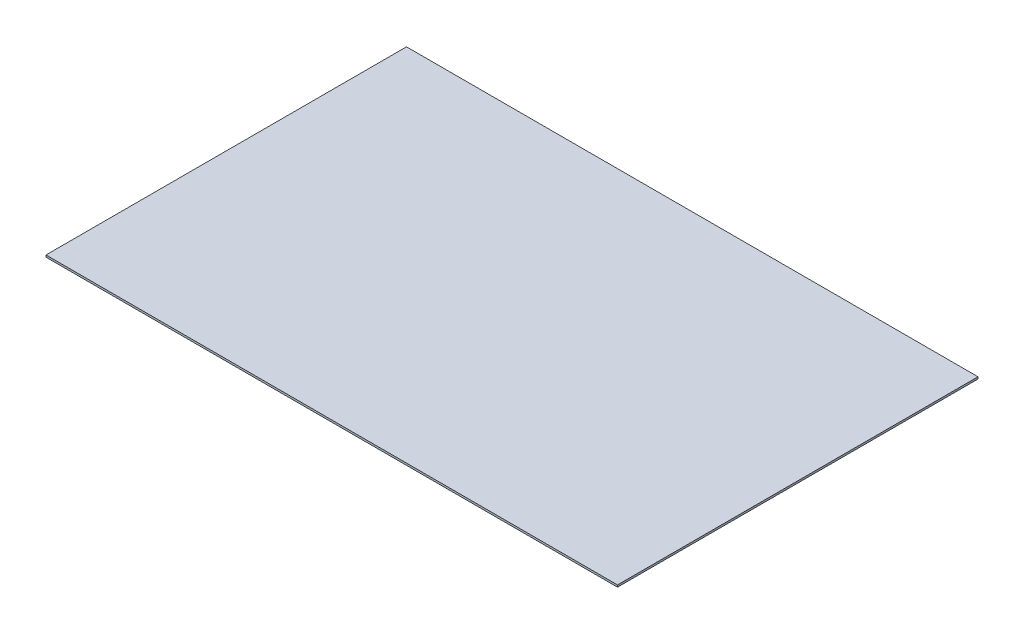
ISO-10303-21;
HEADER;
FILE_DESCRIPTION(('STEP AP214'),'2;1');
FILE_NAME('part.step','',(''),(''),'','','');
FILE_SCHEMA(('AUTOMOTIVE_DESIGN { 1 0 10303 214 1 1 1 1 }'));
ENDSEC;
DATA;
#1=APPLICATION_CONTEXT('core data for automotive mechanical design processes');
#2=APPLICATION_PROTOCOL_DEFINITION('international standard','automotive_design',2000,#1);
#3=PRODUCT_CONTEXT('',#1,'mechanical');
#4=PRODUCT('Part','Part','',(#3));
#5=PRODUCT_RELATED_PRODUCT_CATEGORY('part','',(#4));
#6=PRODUCT_DEFINITION_FORMATION('','',#4);
#7=PRODUCT_DEFINITION_CONTEXT('part definition',#1,'design');
#8=PRODUCT_DEFINITION('design','',#6,#7);
#9=PRODUCT_DEFINITION_SHAPE('','',#8);
#10=(LENGTH_UNIT() NAMED_UNIT(*) SI_UNIT(.MILLI.,.METRE.));
#11=(NAMED_UNIT(*) PLANE_ANGLE_UNIT() SI_UNIT($,.RADIAN.));
#12=(NAMED_UNIT(*) SI_UNIT($,.STERADIAN.) SOLID_ANGLE_UNIT());
#13=UNCERTAINTY_MEASURE_WITH_UNIT(LENGTH_MEASURE(1.E-05),#10,'distance_accuracy_value','');
#14=(GEOMETRIC_REPRESENTATION_CONTEXT(3) GLOBAL_UNCERTAINTY_ASSIGNED_CONTEXT((#13)) GLOBAL_UNIT_ASSIGNED_CONTEXT((#10,
#11,#12)) REPRESENTATION_CONTEXT('',''));
#15=CARTESIAN_POINT('',(0.,0.,0.));
#16=DIRECTION('',(0.,0.,1.));
#17=DIRECTION('',(1.,0.,0.));
#18=AXIS2_PLACEMENT_3D('',#15,#16,#17);
#19=CARTESIAN_POINT('',(319.883383766729,-2.99999999999945,243.174946603476));
#20=DIRECTION('',(0.,0.,-1.));
#21=DIRECTION('',(0.,1.,0.));
#22=AXIS2_PLACEMENT_3D('',#19,#20,#21);
#23=PLANE('',#22);
#24=DIRECTION('',(1.,0.,0.));
#25=VECTOR('',#24,1.);
#26=CARTESIAN_POINT('',(319.883383766729,5.55111512312578E-13,243.174946603476));
#27=LINE('',#26,#25);
#28=CARTESIAN_POINT('',(432.883383766729,-2.22044604925031E-13,243.174946603476));
#29=VERTEX_POINT('',#28);
#30=CARTESIAN_POINT('',(-437.964067469527,0.,243.174946603476));
#31=VERTEX_POINT('',#30);
#32=EDGE_CURVE('E65',#29,#31,#27,.F.);
#33=ORIENTED_EDGE('',*,*,#32,.T.);
#34=DIRECTION('',(0.,1.,0.));
#35=VECTOR('',#34,1.);
#36=CARTESIAN_POINT('',(-437.964067469527,-3.,243.174946603476));
#37=LINE('',#36,#35);
#38=CARTESIAN_POINT('',(-437.964067469527,-3.,243.174946603476));
#39=VERTEX_POINT('',#38);
#40=EDGE_CURVE('E114',#39,#31,#37,.T.);
#41=ORIENTED_EDGE('',*,*,#40,.F.);
#42=DIRECTION('',(-1.,0.,0.));
#43=VECTOR('',#42,1.);
#44=CARTESIAN_POINT('',(319.883383766728,-2.99999999999945,243.174946603476));
#45=LINE('',#44,#43);
#46=CARTESIAN_POINT('',(432.883383766729,-3.00000000000022,243.174946603476));
#47=VERTEX_POINT('',#46);
#48=EDGE_CURVE('E108',#47,#39,#45,.T.);
#49=ORIENTED_EDGE('',*,*,#48,.F.);
#50=DIRECTION('',(0.,1.,0.));
#51=VECTOR('',#50,1.);
#52=CARTESIAN_POINT('',(432.883383766729,-3.00000000000022,243.174946603476));
#53=LINE('',#52,#51);
#54=EDGE_CURVE('E71',#47,#29,#53,.T.);
#55=ORIENTED_EDGE('',*,*,#54,.T.);
#56=EDGE_LOOP('',(#33,#41,#49,#55));
#57=FACE_BOUND('',#56,.T.);
#58=ADVANCED_FACE('F61',(#57),#23,.F.);
#59=CARTESIAN_POINT('',(432.883383766729,-3.00000000000022,-306.142300289278));
#60=DIRECTION('',(0.,0.,1.));
#61=DIRECTION('',(0.,-1.,0.));
#62=AXIS2_PLACEMENT_3D('',#59,#60,#61);
#63=PLANE('',#62);
#64=DIRECTION('',(1.,0.,0.));
#65=VECTOR('',#64,1.);
#66=CARTESIAN_POINT('',(319.883383766728,-2.99999999999945,-306.142300289278));
#67=LINE('',#66,#65);
#68=CARTESIAN_POINT('',(-437.964067469527,-3.,-306.142300289278));
#69=VERTEX_POINT('',#68);
#70=CARTESIAN_POINT('',(432.883383766729,-3.00000000000022,-306.142300289278));
#71=VERTEX_POINT('',#70);
#72=EDGE_CURVE('E102',#69,#71,#67,.T.);
#73=ORIENTED_EDGE('',*,*,#72,.F.);
#74=DIRECTION('',(0.,1.,0.));
#75=VECTOR('',#74,1.);
#76=CARTESIAN_POINT('',(-437.964067469527,-3.,-306.142300289278));
#77=LINE('',#76,#75);
#78=CARTESIAN_POINT('',(-437.964067469527,0.,-306.142300289278));
#79=VERTEX_POINT('',#78);
#80=EDGE_CURVE('E118',#69,#79,#77,.T.);
#81=ORIENTED_EDGE('',*,*,#80,.T.);
#82=DIRECTION('',(-1.,0.,0.));
#83=VECTOR('',#82,1.);
#84=CARTESIAN_POINT('',(432.883383766729,-2.22044604925031E-13,-306.142300289278));
#85=LINE('',#84,#83);
#86=CARTESIAN_POINT('',(432.883383766729,-2.22044604925031E-13,-306.142300289278));
#87=VERTEX_POINT('',#86);
#88=EDGE_CURVE('E98',#79,#87,#85,.F.);
#89=ORIENTED_EDGE('',*,*,#88,.T.);
#90=DIRECTION('',(0.,1.,0.));
#91=VECTOR('',#90,1.);
#92=CARTESIAN_POINT('',(432.883383766729,-3.00000000000022,-306.142300289278));
#93=LINE('',#92,#91);
#94=EDGE_CURVE('E13',#71,#87,#93,.T.);
#95=ORIENTED_EDGE('',*,*,#94,.F.);
#96=EDGE_LOOP('',(#73,#81,#89,#95));
#97=FACE_BOUND('',#96,.T.);
#98=ADVANCED_FACE('F134',(#97),#63,.F.);
#99=CARTESIAN_POINT('',(319.883383766728,-2.99999999999945,0.));
#100=DIRECTION('',(0.,1.,0.));
#101=DIRECTION('',(-1.,0.,0.));
#102=AXIS2_PLACEMENT_3D('',#99,#100,#101);
#103=PLANE('',#102);
#104=ORIENTED_EDGE('',*,*,#48,.T.);
#105=DIRECTION('',(0.,0.,1.));
#106=VECTOR('',#105,1.);
#107=CARTESIAN_POINT('',(-437.964067469527,-3.,-306.142300289278));
#108=LINE('',#107,#106);
#109=EDGE_CURVE('E123',#69,#39,#108,.T.);
#110=ORIENTED_EDGE('',*,*,#109,.F.);
#111=ORIENTED_EDGE('',*,*,#72,.T.);
#112=DIRECTION('',(0.,0.,1.));
#113=VECTOR('',#112,1.);
#114=CARTESIAN_POINT('',(432.883383766729,-3.00000000000022,0.));
#115=LINE('',#114,#113);
#116=EDGE_CURVE('E80',#71,#47,#115,.T.);
#117=ORIENTED_EDGE('',*,*,#116,.T.);
#118=EDGE_LOOP('',(#104,#110,#111,#117));
#119=FACE_BOUND('',#118,.T.);
#120=ADVANCED_FACE('F133',(#119),#103,.F.);
#121=CARTESIAN_POINT('',(0.,0.,0.));
#122=DIRECTION('',(0.,1.,0.));
#123=DIRECTION('',(0.,0.,1.));
#124=AXIS2_PLACEMENT_3D('',#121,#122,#123);
#125=PLANE('',#124);
#126=ORIENTED_EDGE('',*,*,#88,.F.);
#127=DIRECTION('',(0.,0.,1.));
#128=VECTOR('',#127,1.);
#129=CARTESIAN_POINT('',(-437.964067469527,0.,-306.142300289278));
#130=LINE('',#129,#128);
#131=EDGE_CURVE('E122',#79,#31,#130,.T.);
#132=ORIENTED_EDGE('',*,*,#131,.T.);
#133=ORIENTED_EDGE('',*,*,#32,.F.);
#134=DIRECTION('',(0.,0.,-1.));
#135=VECTOR('',#134,1.);
#136=CARTESIAN_POINT('',(432.883383766729,-2.22044604925031E-13,243.174946603476));
#137=LINE('',#136,#135);
#138=EDGE_CURVE('E90',#87,#29,#137,.F.);
#139=ORIENTED_EDGE('',*,*,#138,.F.);
#140=EDGE_LOOP('',(#126,#132,#133,#139));
#141=FACE_BOUND('',#140,.T.);
#142=ADVANCED_FACE('F63',(#141),#125,.T.);
#143=CARTESIAN_POINT('',(432.883383766729,-3.00000000000022,243.174946603476));
#144=DIRECTION('',(-1.,0.,0.));
#145=DIRECTION('',(0.,-1.,0.));
#146=AXIS2_PLACEMENT_3D('',#143,#144,#145);
#147=PLANE('',#146);
#148=ORIENTED_EDGE('',*,*,#138,.T.);
#149=ORIENTED_EDGE('',*,*,#54,.F.);
#150=ORIENTED_EDGE('',*,*,#116,.F.);
#151=ORIENTED_EDGE('',*,*,#94,.T.);
#152=EDGE_LOOP('',(#148,#149,#150,#151));
#153=FACE_BOUND('',#152,.T.);
#154=ADVANCED_FACE('F135',(#153),#147,.F.);
#155=CARTESIAN_POINT('',(-437.964067469527,-3.,-306.142300289278));
#156=DIRECTION('',(-1.,0.,0.));
#157=DIRECTION('',(0.,0.,1.));
#158=AXIS2_PLACEMENT_3D('',#155,#156,#157);
#159=PLANE('',#158);
#160=ORIENTED_EDGE('',*,*,#131,.F.);
#161=ORIENTED_EDGE('',*,*,#80,.F.);
#162=ORIENTED_EDGE('',*,*,#109,.T.);
#163=ORIENTED_EDGE('',*,*,#40,.T.);
#164=EDGE_LOOP('',(#160,#161,#162,#163));
#165=FACE_BOUND('',#164,.T.);
#166=ADVANCED_FACE('F121',(#165),#159,.T.);
#167=CLOSED_SHELL('',(#58,#98,#120,#142,#154,#166));
#168=MANIFOLD_SOLID_BREP('B2',#167);
#169=ADVANCED_BREP_SHAPE_REPRESENTATION('',(#18,#168),#14);
#170=SHAPE_DEFINITION_REPRESENTATION(#9,#169);
ENDSEC;
END-ISO-10303-21;
